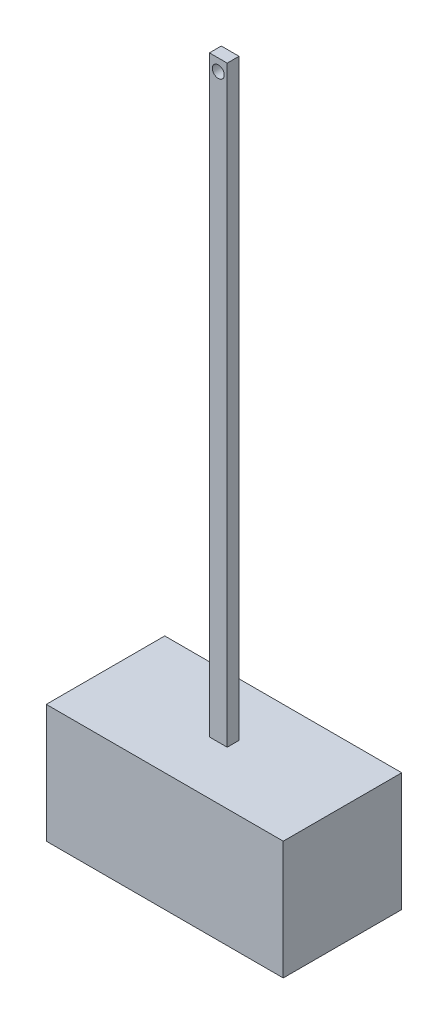
ISO-10303-21;
HEADER;
FILE_DESCRIPTION(('STEP AP214'),'2;1');
FILE_NAME('part.step','',(''),(''),'','','');
FILE_SCHEMA(('AUTOMOTIVE_DESIGN { 1 0 10303 214 1 1 1 1 }'));
ENDSEC;
DATA;
#1=APPLICATION_CONTEXT('core data for automotive mechanical design processes');
#2=APPLICATION_PROTOCOL_DEFINITION('international standard','automotive_design',2000,#1);
#3=PRODUCT_CONTEXT('',#1,'mechanical');
#4=PRODUCT('Part','Part','',(#3));
#5=PRODUCT_RELATED_PRODUCT_CATEGORY('part','',(#4));
#6=PRODUCT_DEFINITION_FORMATION('','',#4);
#7=PRODUCT_DEFINITION_CONTEXT('part definition',#1,'design');
#8=PRODUCT_DEFINITION('design','',#6,#7);
#9=PRODUCT_DEFINITION_SHAPE('','',#8);
#10=(LENGTH_UNIT() NAMED_UNIT(*) SI_UNIT(.MILLI.,.METRE.));
#11=(NAMED_UNIT(*) PLANE_ANGLE_UNIT() SI_UNIT($,.RADIAN.));
#12=(NAMED_UNIT(*) SI_UNIT($,.STERADIAN.) SOLID_ANGLE_UNIT());
#13=UNCERTAINTY_MEASURE_WITH_UNIT(LENGTH_MEASURE(1.E-05),#10,'distance_accuracy_value','');
#14=(GEOMETRIC_REPRESENTATION_CONTEXT(3) GLOBAL_UNCERTAINTY_ASSIGNED_CONTEXT((#13)) GLOBAL_UNIT_ASSIGNED_CONTEXT((#10,
#11,#12)) REPRESENTATION_CONTEXT('',''));
#15=CARTESIAN_POINT('',(0.,0.,0.));
#16=DIRECTION('',(0.,0.,1.));
#17=DIRECTION('',(1.,0.,0.));
#18=AXIS2_PLACEMENT_3D('',#15,#16,#17);
#19=CARTESIAN_POINT('',(0.,0.,10.));
#20=DIRECTION('',(0.,0.,1.));
#21=DIRECTION('',(1.,0.,0.));
#22=AXIS2_PLACEMENT_3D('',#19,#20,#21);
#23=PLANE('',#22);
#24=DIRECTION('',(0.,-1.,0.));
#25=VECTOR('',#24,1.);
#26=CARTESIAN_POINT('',(-7.5,10.,10.));
#27=LINE('',#26,#25);
#28=CARTESIAN_POINT('',(-7.5,10.,10.));
#29=VERTEX_POINT('',#28);
#30=CARTESIAN_POINT('',(-7.5,-490.,10.));
#31=VERTEX_POINT('',#30);
#32=EDGE_CURVE('E79',#29,#31,#27,.T.);
#33=ORIENTED_EDGE('',*,*,#32,.T.);
#34=DIRECTION('',(1.,0.,0.));
#35=VECTOR('',#34,1.);
#36=CARTESIAN_POINT('',(-7.49999999999994,-490.,10.));
#37=LINE('',#36,#35);
#38=CARTESIAN_POINT('',(7.50000000000006,-490.,10.));
#39=VERTEX_POINT('',#38);
#40=EDGE_CURVE('E110',#31,#39,#37,.T.);
#41=ORIENTED_EDGE('',*,*,#40,.T.);
#42=DIRECTION('',(0.,1.,0.));
#43=VECTOR('',#42,1.);
#44=CARTESIAN_POINT('',(7.5,10.,10.));
#45=LINE('',#44,#43);
#46=CARTESIAN_POINT('',(7.5,10.,10.));
#47=VERTEX_POINT('',#46);
#48=EDGE_CURVE('E105',#39,#47,#45,.T.);
#49=ORIENTED_EDGE('',*,*,#48,.T.);
#50=DIRECTION('',(-1.,0.,0.));
#51=VECTOR('',#50,1.);
#52=CARTESIAN_POINT('',(-7.5,10.,10.));
#53=LINE('',#52,#51);
#54=EDGE_CURVE('E52',#47,#29,#53,.T.);
#55=ORIENTED_EDGE('',*,*,#54,.T.);
#56=EDGE_LOOP('',(#33,#41,#49,#55));
#57=FACE_BOUND('',#56,.T.);
#58=CARTESIAN_POINT('',(0.,0.,10.));
#59=DIRECTION('',(0.,0.,1.));
#60=DIRECTION('',(1.,0.,0.));
#61=AXIS2_PLACEMENT_3D('',#58,#59,#60);
#62=CIRCLE('',#61,5.);
#63=CARTESIAN_POINT('',(5.,0.,10.));
#64=VERTEX_POINT('',#63);
#65=EDGE_CURVE('E91',#64,#64,#62,.T.);
#66=ORIENTED_EDGE('',*,*,#65,.F.);
#67=EDGE_LOOP('',(#66));
#68=FACE_BOUND('',#67,.T.);
#69=ADVANCED_FACE('F35',(#57,#68),#23,.T.);
#70=CARTESIAN_POINT('',(0.,0.,0.));
#71=DIRECTION('',(0.,0.,1.));
#72=DIRECTION('',(1.,0.,0.));
#73=AXIS2_PLACEMENT_3D('',#70,#71,#72);
#74=PLANE('',#73);
#75=DIRECTION('',(0.,-1.,0.));
#76=VECTOR('',#75,1.);
#77=CARTESIAN_POINT('',(-7.5,10.,0.));
#78=LINE('',#77,#76);
#79=CARTESIAN_POINT('',(-7.5,10.,0.));
#80=VERTEX_POINT('',#79);
#81=CARTESIAN_POINT('',(-7.5,-490.,0.));
#82=VERTEX_POINT('',#81);
#83=EDGE_CURVE('E85',#80,#82,#78,.T.);
#84=ORIENTED_EDGE('',*,*,#83,.F.);
#85=DIRECTION('',(-1.,0.,0.));
#86=VECTOR('',#85,1.);
#87=CARTESIAN_POINT('',(-7.5,10.,0.));
#88=LINE('',#87,#86);
#89=CARTESIAN_POINT('',(7.5,10.,0.));
#90=VERTEX_POINT('',#89);
#91=EDGE_CURVE('E71',#90,#80,#88,.T.);
#92=ORIENTED_EDGE('',*,*,#91,.F.);
#93=DIRECTION('',(0.,1.,0.));
#94=VECTOR('',#93,1.);
#95=CARTESIAN_POINT('',(7.5,10.,0.));
#96=LINE('',#95,#94);
#97=CARTESIAN_POINT('',(7.50000000000006,-490.,0.));
#98=VERTEX_POINT('',#97);
#99=EDGE_CURVE('E66',#98,#90,#96,.T.);
#100=ORIENTED_EDGE('',*,*,#99,.F.);
#101=DIRECTION('',(1.,0.,0.));
#102=VECTOR('',#101,1.);
#103=CARTESIAN_POINT('',(-7.49999999999994,-490.,0.));
#104=LINE('',#103,#102);
#105=EDGE_CURVE('E90',#82,#98,#104,.T.);
#106=ORIENTED_EDGE('',*,*,#105,.F.);
#107=EDGE_LOOP('',(#84,#92,#100,#106));
#108=FACE_BOUND('',#107,.T.);
#109=CARTESIAN_POINT('',(0.,0.,0.));
#110=DIRECTION('',(0.,0.,1.));
#111=DIRECTION('',(1.,0.,0.));
#112=AXIS2_PLACEMENT_3D('',#109,#110,#111);
#113=CIRCLE('',#112,5.);
#114=CARTESIAN_POINT('',(5.,0.,0.));
#115=VERTEX_POINT('',#114);
#116=EDGE_CURVE('E95',#115,#115,#113,.T.);
#117=ORIENTED_EDGE('',*,*,#116,.T.);
#118=EDGE_LOOP('',(#117));
#119=FACE_BOUND('',#118,.T.);
#120=ADVANCED_FACE('F88',(#108,#119),#74,.F.);
#121=CARTESIAN_POINT('',(-7.5,10.,10.));
#122=DIRECTION('',(1.,0.,0.));
#123=DIRECTION('',(0.,1.,0.));
#124=AXIS2_PLACEMENT_3D('',#121,#122,#123);
#125=PLANE('',#124);
#126=ORIENTED_EDGE('',*,*,#83,.T.);
#127=DIRECTION('',(0.,0.,-1.));
#128=VECTOR('',#127,1.);
#129=CARTESIAN_POINT('',(-7.49999999999994,-490.,10.));
#130=LINE('',#129,#128);
#131=EDGE_CURVE('E11',#31,#82,#130,.T.);
#132=ORIENTED_EDGE('',*,*,#131,.F.);
#133=ORIENTED_EDGE('',*,*,#32,.F.);
#134=DIRECTION('',(0.,0.,-1.));
#135=VECTOR('',#134,1.);
#136=CARTESIAN_POINT('',(-7.5,10.,10.));
#137=LINE('',#136,#135);
#138=EDGE_CURVE('E74',#29,#80,#137,.T.);
#139=ORIENTED_EDGE('',*,*,#138,.T.);
#140=EDGE_LOOP('',(#126,#132,#133,#139));
#141=FACE_BOUND('',#140,.T.);
#142=ADVANCED_FACE('F37',(#141),#125,.F.);
#143=CARTESIAN_POINT('',(7.5,10.,10.));
#144=DIRECTION('',(-1.,0.,0.));
#145=DIRECTION('',(0.,-1.,0.));
#146=AXIS2_PLACEMENT_3D('',#143,#144,#145);
#147=PLANE('',#146);
#148=ORIENTED_EDGE('',*,*,#99,.T.);
#149=DIRECTION('',(0.,0.,-1.));
#150=VECTOR('',#149,1.);
#151=CARTESIAN_POINT('',(7.5,10.,10.));
#152=LINE('',#151,#150);
#153=EDGE_CURVE('E76',#47,#90,#152,.T.);
#154=ORIENTED_EDGE('',*,*,#153,.F.);
#155=ORIENTED_EDGE('',*,*,#48,.F.);
#156=DIRECTION('',(0.,0.,-1.));
#157=VECTOR('',#156,1.);
#158=CARTESIAN_POINT('',(7.50000000000006,-490.,10.));
#159=LINE('',#158,#157);
#160=EDGE_CURVE('E44',#39,#98,#159,.T.);
#161=ORIENTED_EDGE('',*,*,#160,.T.);
#162=EDGE_LOOP('',(#148,#154,#155,#161));
#163=FACE_BOUND('',#162,.T.);
#164=ADVANCED_FACE('F103',(#163),#147,.F.);
#165=CARTESIAN_POINT('',(-7.5,10.,10.));
#166=DIRECTION('',(0.,-1.,0.));
#167=DIRECTION('',(0.,0.,-1.));
#168=AXIS2_PLACEMENT_3D('',#165,#166,#167);
#169=PLANE('',#168);
#170=ORIENTED_EDGE('',*,*,#91,.T.);
#171=ORIENTED_EDGE('',*,*,#138,.F.);
#172=ORIENTED_EDGE('',*,*,#54,.F.);
#173=ORIENTED_EDGE('',*,*,#153,.T.);
#174=EDGE_LOOP('',(#170,#171,#172,#173));
#175=FACE_BOUND('',#174,.T.);
#176=ADVANCED_FACE('F73',(#175),#169,.F.);
#177=CARTESIAN_POINT('',(0.,0.,10.));
#178=DIRECTION('',(0.,0.,-1.));
#179=DIRECTION('',(-1.,0.,0.));
#180=AXIS2_PLACEMENT_3D('',#177,#178,#179);
#181=CYLINDRICAL_SURFACE('',#180,5.);
#182=ORIENTED_EDGE('',*,*,#65,.T.);
#183=EDGE_LOOP('',(#182));
#184=FACE_BOUND('',#183,.T.);
#185=ORIENTED_EDGE('',*,*,#116,.F.);
#186=EDGE_LOOP('',(#185));
#187=FACE_BOUND('',#186,.T.);
#188=ADVANCED_FACE('F189',(#184,#187),#181,.F.);
#189=CARTESIAN_POINT('',(0.,-490.,0.));
#190=DIRECTION('',(0.,-1.,0.));
#191=DIRECTION('',(0.,0.,-1.));
#192=AXIS2_PLACEMENT_3D('',#189,#190,#191);
#193=PLANE('',#192);
#194=DIRECTION('',(0.,0.,1.));
#195=VECTOR('',#194,1.);
#196=CARTESIAN_POINT('',(99.8000000000001,-490.,55.));
#197=LINE('',#196,#195);
#198=CARTESIAN_POINT('',(99.8000000000001,-490.,-45.));
#199=VERTEX_POINT('',#198);
#200=CARTESIAN_POINT('',(99.8000000000001,-490.,55.));
#201=VERTEX_POINT('',#200);
#202=EDGE_CURVE('E142',#199,#201,#197,.T.);
#203=ORIENTED_EDGE('',*,*,#202,.F.);
#204=DIRECTION('',(1.,0.,0.));
#205=VECTOR('',#204,1.);
#206=CARTESIAN_POINT('',(-100.2,-490.,-45.));
#207=LINE('',#206,#205);
#208=CARTESIAN_POINT('',(-100.2,-490.,-45.));
#209=VERTEX_POINT('',#208);
#210=EDGE_CURVE('E132',#209,#199,#207,.T.);
#211=ORIENTED_EDGE('',*,*,#210,.F.);
#212=DIRECTION('',(0.,0.,-1.));
#213=VECTOR('',#212,1.);
#214=CARTESIAN_POINT('',(-100.2,-490.,55.));
#215=LINE('',#214,#213);
#216=CARTESIAN_POINT('',(-100.2,-490.,55.));
#217=VERTEX_POINT('',#216);
#218=EDGE_CURVE('E136',#217,#209,#215,.T.);
#219=ORIENTED_EDGE('',*,*,#218,.F.);
#220=DIRECTION('',(-1.,0.,0.));
#221=VECTOR('',#220,1.);
#222=CARTESIAN_POINT('',(-100.2,-490.,55.));
#223=LINE('',#222,#221);
#224=EDGE_CURVE('E139',#201,#217,#223,.T.);
#225=ORIENTED_EDGE('',*,*,#224,.F.);
#226=EDGE_LOOP('',(#203,#211,#219,#225));
#227=FACE_BOUND('',#226,.T.);
#228=ORIENTED_EDGE('',*,*,#40,.F.);
#229=ORIENTED_EDGE('',*,*,#131,.T.);
#230=ORIENTED_EDGE('',*,*,#105,.T.);
#231=ORIENTED_EDGE('',*,*,#160,.F.);
#232=EDGE_LOOP('',(#228,#229,#230,#231));
#233=FACE_BOUND('',#232,.T.);
#234=ADVANCED_FACE('F109',(#227,#233),#193,.F.);
#235=CARTESIAN_POINT('',(99.8000000000001,-590.,55.));
#236=DIRECTION('',(-1.,0.,0.));
#237=DIRECTION('',(0.,0.,1.));
#238=AXIS2_PLACEMENT_3D('',#235,#236,#237);
#239=PLANE('',#238);
#240=ORIENTED_EDGE('',*,*,#202,.T.);
#241=DIRECTION('',(0.,1.,0.));
#242=VECTOR('',#241,1.);
#243=CARTESIAN_POINT('',(99.8000000000001,-590.,55.));
#244=LINE('',#243,#242);
#245=CARTESIAN_POINT('',(99.8000000000001,-590.,55.));
#246=VERTEX_POINT('',#245);
#247=EDGE_CURVE('E118',#246,#201,#244,.T.);
#248=ORIENTED_EDGE('',*,*,#247,.F.);
#249=DIRECTION('',(0.,0.,1.));
#250=VECTOR('',#249,1.);
#251=CARTESIAN_POINT('',(99.8000000000001,-590.,55.));
#252=LINE('',#251,#250);
#253=CARTESIAN_POINT('',(99.8000000000001,-590.,-45.));
#254=VERTEX_POINT('',#253);
#255=EDGE_CURVE('E135',#254,#246,#252,.T.);
#256=ORIENTED_EDGE('',*,*,#255,.F.);
#257=DIRECTION('',(0.,1.,0.));
#258=VECTOR('',#257,1.);
#259=CARTESIAN_POINT('',(99.8000000000001,-590.,-45.));
#260=LINE('',#259,#258);
#261=EDGE_CURVE('E128',#254,#199,#260,.T.);
#262=ORIENTED_EDGE('',*,*,#261,.T.);
#263=EDGE_LOOP('',(#240,#248,#256,#262));
#264=FACE_BOUND('',#263,.T.);
#265=ADVANCED_FACE('F167',(#264),#239,.F.);
#266=CARTESIAN_POINT('',(-100.2,-590.,55.));
#267=DIRECTION('',(0.,0.,-1.));
#268=DIRECTION('',(-1.,0.,0.));
#269=AXIS2_PLACEMENT_3D('',#266,#267,#268);
#270=PLANE('',#269);
#271=ORIENTED_EDGE('',*,*,#224,.T.);
#272=DIRECTION('',(0.,1.,0.));
#273=VECTOR('',#272,1.);
#274=CARTESIAN_POINT('',(-100.2,-590.,55.));
#275=LINE('',#274,#273);
#276=CARTESIAN_POINT('',(-100.2,-590.,55.));
#277=VERTEX_POINT('',#276);
#278=EDGE_CURVE('E122',#277,#217,#275,.T.);
#279=ORIENTED_EDGE('',*,*,#278,.F.);
#280=DIRECTION('',(-1.,0.,0.));
#281=VECTOR('',#280,1.);
#282=CARTESIAN_POINT('',(-100.2,-590.,55.));
#283=LINE('',#282,#281);
#284=EDGE_CURVE('E150',#246,#277,#283,.T.);
#285=ORIENTED_EDGE('',*,*,#284,.F.);
#286=ORIENTED_EDGE('',*,*,#247,.T.);
#287=EDGE_LOOP('',(#271,#279,#285,#286));
#288=FACE_BOUND('',#287,.T.);
#289=ADVANCED_FACE('F171',(#288),#270,.F.);
#290=CARTESIAN_POINT('',(-100.2,-590.,55.));
#291=DIRECTION('',(1.,0.,0.));
#292=DIRECTION('',(0.,0.,-1.));
#293=AXIS2_PLACEMENT_3D('',#290,#291,#292);
#294=PLANE('',#293);
#295=ORIENTED_EDGE('',*,*,#218,.T.);
#296=DIRECTION('',(0.,1.,0.));
#297=VECTOR('',#296,1.);
#298=CARTESIAN_POINT('',(-100.2,-590.,-45.));
#299=LINE('',#298,#297);
#300=CARTESIAN_POINT('',(-100.2,-590.,-45.));
#301=VERTEX_POINT('',#300);
#302=EDGE_CURVE('E125',#301,#209,#299,.T.);
#303=ORIENTED_EDGE('',*,*,#302,.F.);
#304=DIRECTION('',(0.,0.,-1.));
#305=VECTOR('',#304,1.);
#306=CARTESIAN_POINT('',(-100.2,-590.,55.));
#307=LINE('',#306,#305);
#308=EDGE_CURVE('E147',#277,#301,#307,.T.);
#309=ORIENTED_EDGE('',*,*,#308,.F.);
#310=ORIENTED_EDGE('',*,*,#278,.T.);
#311=EDGE_LOOP('',(#295,#303,#309,#310));
#312=FACE_BOUND('',#311,.T.);
#313=ADVANCED_FACE('F259',(#312),#294,.F.);
#314=CARTESIAN_POINT('',(-100.2,-590.,-45.));
#315=DIRECTION('',(0.,0.,1.));
#316=DIRECTION('',(1.,0.,0.));
#317=AXIS2_PLACEMENT_3D('',#314,#315,#316);
#318=PLANE('',#317);
#319=ORIENTED_EDGE('',*,*,#210,.T.);
#320=ORIENTED_EDGE('',*,*,#261,.F.);
#321=DIRECTION('',(1.,0.,0.));
#322=VECTOR('',#321,1.);
#323=CARTESIAN_POINT('',(-100.2,-590.,-45.));
#324=LINE('',#323,#322);
#325=EDGE_CURVE('E131',#301,#254,#324,.T.);
#326=ORIENTED_EDGE('',*,*,#325,.F.);
#327=ORIENTED_EDGE('',*,*,#302,.T.);
#328=EDGE_LOOP('',(#319,#320,#326,#327));
#329=FACE_BOUND('',#328,.T.);
#330=ADVANCED_FACE('F186',(#329),#318,.F.);
#331=CARTESIAN_POINT('',(0.,-590.,0.));
#332=DIRECTION('',(0.,-1.,0.));
#333=DIRECTION('',(0.,0.,-1.));
#334=AXIS2_PLACEMENT_3D('',#331,#332,#333);
#335=PLANE('',#334);
#336=ORIENTED_EDGE('',*,*,#255,.T.);
#337=ORIENTED_EDGE('',*,*,#284,.T.);
#338=ORIENTED_EDGE('',*,*,#308,.T.);
#339=ORIENTED_EDGE('',*,*,#325,.T.);
#340=EDGE_LOOP('',(#336,#337,#338,#339));
#341=FACE_BOUND('',#340,.T.);
#342=ADVANCED_FACE('F158',(#341),#335,.T.);
#343=CLOSED_SHELL('',(#69,#120,#142,#164,#176,#188,#234,#265,#289,#313,#330,#342));
#344=MANIFOLD_SOLID_BREP('B2',#343);
#345=ADVANCED_BREP_SHAPE_REPRESENTATION('',(#18,#344),#14);
#346=SHAPE_DEFINITION_REPRESENTATION(#9,#345);
ENDSEC;
END-ISO-10303-21;
